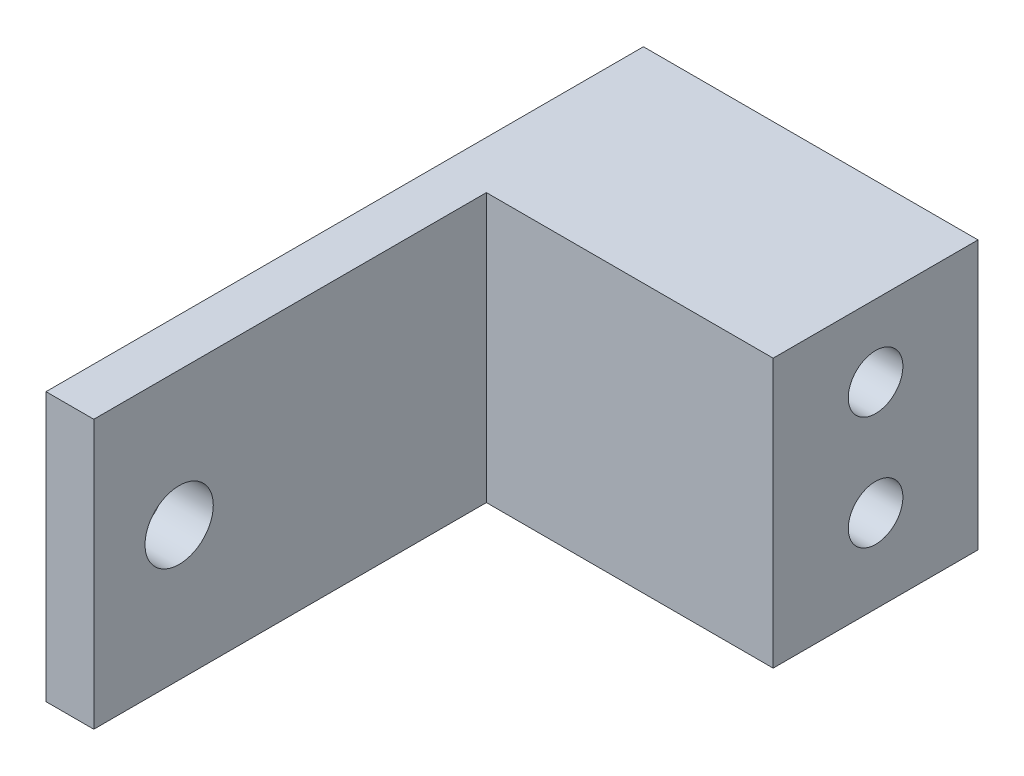
ISO-10303-21;
HEADER;
FILE_DESCRIPTION(('STEP AP214'),'2;1');
FILE_NAME('part.step','',(''),(''),'','','');
FILE_SCHEMA(('AUTOMOTIVE_DESIGN { 1 0 10303 214 1 1 1 1 }'));
ENDSEC;
DATA;
#1=APPLICATION_CONTEXT('core data for automotive mechanical design processes');
#2=APPLICATION_PROTOCOL_DEFINITION('international standard','automotive_design',2000,#1);
#3=PRODUCT_CONTEXT('',#1,'mechanical');
#4=PRODUCT('Part','Part','',(#3));
#5=PRODUCT_RELATED_PRODUCT_CATEGORY('part','',(#4));
#6=PRODUCT_DEFINITION_FORMATION('','',#4);
#7=PRODUCT_DEFINITION_CONTEXT('part definition',#1,'design');
#8=PRODUCT_DEFINITION('design','',#6,#7);
#9=PRODUCT_DEFINITION_SHAPE('','',#8);
#10=(LENGTH_UNIT() NAMED_UNIT(*) SI_UNIT(.MILLI.,.METRE.));
#11=(NAMED_UNIT(*) PLANE_ANGLE_UNIT() SI_UNIT($,.RADIAN.));
#12=(NAMED_UNIT(*) SI_UNIT($,.STERADIAN.) SOLID_ANGLE_UNIT());
#13=UNCERTAINTY_MEASURE_WITH_UNIT(LENGTH_MEASURE(1.E-05),#10,'distance_accuracy_value','');
#14=(GEOMETRIC_REPRESENTATION_CONTEXT(3) GLOBAL_UNCERTAINTY_ASSIGNED_CONTEXT((#13)) GLOBAL_UNIT_ASSIGNED_CONTEXT((#10,
#11,#12)) REPRESENTATION_CONTEXT('',''));
#15=CARTESIAN_POINT('',(0.,0.,0.));
#16=DIRECTION('',(0.,0.,1.));
#17=DIRECTION('',(1.,0.,0.));
#18=AXIS2_PLACEMENT_3D('',#15,#16,#17);
#19=CARTESIAN_POINT('',(16.8979552359479,-107.117375070724,-45.3447882917554));
#20=DIRECTION('',(0.,0.,-1.));
#21=DIRECTION('',(-1.,0.,0.));
#22=AXIS2_PLACEMENT_3D('',#19,#20,#21);
#23=PLANE('',#22);
#24=DIRECTION('',(0.,1.,0.));
#25=VECTOR('',#24,1.);
#26=CARTESIAN_POINT('',(18.2979552359479,-107.117375070724,-45.3447882917554));
#27=LINE('',#26,#25);
#28=CARTESIAN_POINT('',(18.2979552359479,-107.117375070724,-45.3447882917554));
#29=VERTEX_POINT('',#28);
#30=CARTESIAN_POINT('',(18.2979552359479,-99.2531130794142,-45.3447882917554));
#31=VERTEX_POINT('',#30);
#32=EDGE_CURVE('E48',#29,#31,#27,.T.);
#33=ORIENTED_EDGE('',*,*,#32,.F.);
#34=DIRECTION('',(1.,0.,0.));
#35=VECTOR('',#34,1.);
#36=CARTESIAN_POINT('',(16.8979552359479,-107.117375070724,-45.3447882917554));
#37=LINE('',#36,#35);
#38=CARTESIAN_POINT('',(26.6979552359479,-107.117375070724,-45.3447882917554));
#39=VERTEX_POINT('',#38);
#40=EDGE_CURVE('E41',#29,#39,#37,.T.);
#41=ORIENTED_EDGE('',*,*,#40,.T.);
#42=DIRECTION('',(0.,1.,0.));
#43=VECTOR('',#42,1.);
#44=CARTESIAN_POINT('',(26.6979552359479,-107.117375070724,-45.3447882917554));
#45=LINE('',#44,#43);
#46=CARTESIAN_POINT('',(26.6979552359479,-99.2531130794142,-45.3447882917554));
#47=VERTEX_POINT('',#46);
#48=EDGE_CURVE('E87',#39,#47,#45,.T.);
#49=ORIENTED_EDGE('',*,*,#48,.T.);
#50=DIRECTION('',(1.,0.,0.));
#51=VECTOR('',#50,1.);
#52=CARTESIAN_POINT('',(16.8979552359479,-99.2531130794142,-45.3447882917554));
#53=LINE('',#52,#51);
#54=EDGE_CURVE('E81',#31,#47,#53,.T.);
#55=ORIENTED_EDGE('',*,*,#54,.F.);
#56=EDGE_LOOP('',(#33,#41,#49,#55));
#57=FACE_BOUND('',#56,.T.);
#58=ADVANCED_FACE('F33',(#57),#23,.F.);
#59=CARTESIAN_POINT('',(16.8979552359479,-107.117375070724,-51.3447882917554));
#60=DIRECTION('',(0.,0.,1.));
#61=DIRECTION('',(1.,0.,0.));
#62=AXIS2_PLACEMENT_3D('',#59,#60,#61);
#63=PLANE('',#62);
#64=DIRECTION('',(0.,-1.,0.));
#65=VECTOR('',#64,1.);
#66=CARTESIAN_POINT('',(26.6979552359479,-107.117375070724,-51.3447882917554));
#67=LINE('',#66,#65);
#68=CARTESIAN_POINT('',(26.6979552359479,-99.2531130794142,-51.3447882917554));
#69=VERTEX_POINT('',#68);
#70=CARTESIAN_POINT('',(26.6979552359479,-107.117375070724,-51.3447882917554));
#71=VERTEX_POINT('',#70);
#72=EDGE_CURVE('E92',#69,#71,#67,.T.);
#73=ORIENTED_EDGE('',*,*,#72,.T.);
#74=DIRECTION('',(1.,0.,0.));
#75=VECTOR('',#74,1.);
#76=CARTESIAN_POINT('',(16.8979552359479,-107.117375070724,-51.3447882917554));
#77=LINE('',#76,#75);
#78=CARTESIAN_POINT('',(16.8979552359479,-107.117375070724,-51.3447882917554));
#79=VERTEX_POINT('',#78);
#80=EDGE_CURVE('E11',#79,#71,#77,.T.);
#81=ORIENTED_EDGE('',*,*,#80,.F.);
#82=DIRECTION('',(0.,-1.,0.));
#83=VECTOR('',#82,1.);
#84=CARTESIAN_POINT('',(16.8979552359479,-107.117375070724,-51.3447882917554));
#85=LINE('',#84,#83);
#86=CARTESIAN_POINT('',(16.8979552359479,-99.2531130794142,-51.3447882917554));
#87=VERTEX_POINT('',#86);
#88=EDGE_CURVE('E86',#87,#79,#85,.T.);
#89=ORIENTED_EDGE('',*,*,#88,.F.);
#90=DIRECTION('',(1.,0.,0.));
#91=VECTOR('',#90,1.);
#92=CARTESIAN_POINT('',(16.8979552359479,-99.2531130794142,-51.3447882917554));
#93=LINE('',#92,#91);
#94=EDGE_CURVE('E78',#87,#69,#93,.T.);
#95=ORIENTED_EDGE('',*,*,#94,.T.);
#96=EDGE_LOOP('',(#73,#81,#89,#95));
#97=FACE_BOUND('',#96,.T.);
#98=ADVANCED_FACE('F35',(#97),#63,.F.);
#99=CARTESIAN_POINT('',(16.8979552359479,-107.117375070724,-51.3447882917554));
#100=DIRECTION('',(0.,1.,0.));
#101=DIRECTION('',(0.,0.,1.));
#102=AXIS2_PLACEMENT_3D('',#99,#100,#101);
#103=PLANE('',#102);
#104=DIRECTION('',(0.,0.,1.));
#105=VECTOR('',#104,1.);
#106=CARTESIAN_POINT('',(26.6979552359479,-107.117375070724,-51.3447882917554));
#107=LINE('',#106,#105);
#108=EDGE_CURVE('E96',#71,#39,#107,.T.);
#109=ORIENTED_EDGE('',*,*,#108,.T.);
#110=ORIENTED_EDGE('',*,*,#40,.F.);
#111=DIRECTION('',(0.,0.,-1.));
#112=VECTOR('',#111,1.);
#113=CARTESIAN_POINT('',(18.2979552359479,-107.117375070724,-33.8447882917554));
#114=LINE('',#113,#112);
#115=CARTESIAN_POINT('',(18.2979552359479,-107.117375070724,-33.8447882917554));
#116=VERTEX_POINT('',#115);
#117=EDGE_CURVE('E97',#116,#29,#114,.T.);
#118=ORIENTED_EDGE('',*,*,#117,.F.);
#119=DIRECTION('',(1.,0.,0.));
#120=VECTOR('',#119,1.);
#121=CARTESIAN_POINT('',(16.8979552359479,-107.117375070724,-33.8447882917554));
#122=LINE('',#121,#120);
#123=CARTESIAN_POINT('',(16.8979552359479,-107.117375070724,-33.8447882917554));
#124=VERTEX_POINT('',#123);
#125=EDGE_CURVE('E115',#124,#116,#122,.T.);
#126=ORIENTED_EDGE('',*,*,#125,.F.);
#127=DIRECTION('',(0.,0.,1.));
#128=VECTOR('',#127,1.);
#129=CARTESIAN_POINT('',(16.8979552359479,-107.117375070724,-51.3447882917554));
#130=LINE('',#129,#128);
#131=EDGE_CURVE('E112',#79,#124,#130,.T.);
#132=ORIENTED_EDGE('',*,*,#131,.F.);
#133=ORIENTED_EDGE('',*,*,#80,.T.);
#134=EDGE_LOOP('',(#109,#110,#118,#126,#132,#133));
#135=FACE_BOUND('',#134,.T.);
#136=ADVANCED_FACE('F109',(#135),#103,.F.);
#137=CARTESIAN_POINT('',(16.8979552359479,-99.2531130794142,-51.3447882917554));
#138=DIRECTION('',(0.,-1.,0.));
#139=DIRECTION('',(0.,0.,-1.));
#140=AXIS2_PLACEMENT_3D('',#137,#138,#139);
#141=PLANE('',#140);
#142=DIRECTION('',(0.,0.,-1.));
#143=VECTOR('',#142,1.);
#144=CARTESIAN_POINT('',(26.6979552359479,-99.2531130794142,-51.3447882917554));
#145=LINE('',#144,#143);
#146=EDGE_CURVE('E75',#47,#69,#145,.T.);
#147=ORIENTED_EDGE('',*,*,#146,.T.);
#148=ORIENTED_EDGE('',*,*,#94,.F.);
#149=DIRECTION('',(0.,0.,-1.));
#150=VECTOR('',#149,1.);
#151=CARTESIAN_POINT('',(16.8979552359479,-99.2531130794142,-51.3447882917554));
#152=LINE('',#151,#150);
#153=CARTESIAN_POINT('',(16.8979552359479,-99.2531130794142,-33.8447882917554));
#154=VERTEX_POINT('',#153);
#155=EDGE_CURVE('E57',#154,#87,#152,.T.);
#156=ORIENTED_EDGE('',*,*,#155,.F.);
#157=DIRECTION('',(-1.,0.,0.));
#158=VECTOR('',#157,1.);
#159=CARTESIAN_POINT('',(16.8979552359479,-99.2531130794142,-33.8447882917554));
#160=LINE('',#159,#158);
#161=CARTESIAN_POINT('',(18.2979552359479,-99.2531130794142,-33.8447882917554));
#162=VERTEX_POINT('',#161);
#163=EDGE_CURVE('E121',#162,#154,#160,.T.);
#164=ORIENTED_EDGE('',*,*,#163,.F.);
#165=DIRECTION('',(0.,0.,-1.));
#166=VECTOR('',#165,1.);
#167=CARTESIAN_POINT('',(18.2979552359479,-99.2531130794142,-33.8447882917554));
#168=LINE('',#167,#166);
#169=EDGE_CURVE('E101',#162,#31,#168,.T.);
#170=ORIENTED_EDGE('',*,*,#169,.T.);
#171=ORIENTED_EDGE('',*,*,#54,.T.);
#172=EDGE_LOOP('',(#147,#148,#156,#164,#170,#171));
#173=FACE_BOUND('',#172,.T.);
#174=ADVANCED_FACE('F77',(#173),#141,.F.);
#175=CARTESIAN_POINT('',(16.8979552359479,0.,0.));
#176=DIRECTION('',(1.,0.,0.));
#177=DIRECTION('',(0.,0.,-1.));
#178=AXIS2_PLACEMENT_3D('',#175,#176,#177);
#179=PLANE('',#178);
#180=CARTESIAN_POINT('',(16.8979552359479,-104.677829932417,-48.3447882917554));
#181=DIRECTION('',(1.,0.,0.));
#182=DIRECTION('',(0.,0.,-1.));
#183=AXIS2_PLACEMENT_3D('',#180,#181,#182);
#184=CIRCLE('',#183,0.799999999999995);
#185=CARTESIAN_POINT('',(16.8979552359479,-104.677829932417,-49.1447882917554));
#186=VERTEX_POINT('',#185);
#187=EDGE_CURVE('E143',#186,#186,#184,.T.);
#188=ORIENTED_EDGE('',*,*,#187,.T.);
#189=EDGE_LOOP('',(#188));
#190=FACE_BOUND('',#189,.T.);
#191=CARTESIAN_POINT('',(16.8979552359479,-101.359309210704,-48.3447882917554));
#192=DIRECTION('',(1.,0.,0.));
#193=DIRECTION('',(0.,0.,-1.));
#194=AXIS2_PLACEMENT_3D('',#191,#192,#193);
#195=CIRCLE('',#194,0.799999999999995);
#196=CARTESIAN_POINT('',(16.8979552359479,-101.359309210704,-49.1447882917554));
#197=VERTEX_POINT('',#196);
#198=EDGE_CURVE('E137',#197,#197,#195,.T.);
#199=ORIENTED_EDGE('',*,*,#198,.T.);
#200=EDGE_LOOP('',(#199));
#201=FACE_BOUND('',#200,.T.);
#202=CARTESIAN_POINT('',(16.8979552359479,-103.185244075069,-36.3447882917554));
#203=DIRECTION('',(1.,0.,0.));
#204=DIRECTION('',(0.,0.,-1.));
#205=AXIS2_PLACEMENT_3D('',#202,#203,#204);
#206=CIRCLE('',#205,0.999999999999998);
#207=CARTESIAN_POINT('',(16.8979552359479,-103.185244075069,-37.3447882917554));
#208=VERTEX_POINT('',#207);
#209=EDGE_CURVE('E124',#208,#208,#206,.F.);
#210=ORIENTED_EDGE('',*,*,#209,.F.);
#211=EDGE_LOOP('',(#210));
#212=FACE_BOUND('',#211,.T.);
#213=ORIENTED_EDGE('',*,*,#88,.T.);
#214=ORIENTED_EDGE('',*,*,#131,.T.);
#215=DIRECTION('',(0.,-1.,0.));
#216=VECTOR('',#215,1.);
#217=CARTESIAN_POINT('',(16.8979552359479,-107.117375070724,-33.8447882917554));
#218=LINE('',#217,#216);
#219=EDGE_CURVE('E123',#154,#124,#218,.T.);
#220=ORIENTED_EDGE('',*,*,#219,.F.);
#221=ORIENTED_EDGE('',*,*,#155,.T.);
#222=EDGE_LOOP('',(#213,#214,#220,#221));
#223=FACE_BOUND('',#222,.T.);
#224=ADVANCED_FACE('F117',(#190,#201,#212,#223),#179,.F.);
#225=CARTESIAN_POINT('',(26.6979552359479,0.,0.));
#226=DIRECTION('',(1.,0.,0.));
#227=DIRECTION('',(0.,0.,-1.));
#228=AXIS2_PLACEMENT_3D('',#225,#226,#227);
#229=PLANE('',#228);
#230=CARTESIAN_POINT('',(26.6979552359479,-104.677829932417,-48.3447882917554));
#231=DIRECTION('',(1.,0.,0.));
#232=DIRECTION('',(0.,0.,-1.));
#233=AXIS2_PLACEMENT_3D('',#230,#231,#232);
#234=CIRCLE('',#233,0.799999999999995);
#235=CARTESIAN_POINT('',(26.6979552359479,-104.677829932417,-49.1447882917554));
#236=VERTEX_POINT('',#235);
#237=EDGE_CURVE('E146',#236,#236,#234,.T.);
#238=ORIENTED_EDGE('',*,*,#237,.F.);
#239=EDGE_LOOP('',(#238));
#240=FACE_BOUND('',#239,.T.);
#241=CARTESIAN_POINT('',(26.6979552359479,-101.359309210704,-48.3447882917554));
#242=DIRECTION('',(1.,0.,0.));
#243=DIRECTION('',(0.,0.,-1.));
#244=AXIS2_PLACEMENT_3D('',#241,#242,#243);
#245=CIRCLE('',#244,0.799999999999995);
#246=CARTESIAN_POINT('',(26.6979552359479,-101.359309210704,-49.1447882917554));
#247=VERTEX_POINT('',#246);
#248=EDGE_CURVE('E140',#247,#247,#245,.T.);
#249=ORIENTED_EDGE('',*,*,#248,.F.);
#250=EDGE_LOOP('',(#249));
#251=FACE_BOUND('',#250,.T.);
#252=ORIENTED_EDGE('',*,*,#72,.F.);
#253=ORIENTED_EDGE('',*,*,#146,.F.);
#254=ORIENTED_EDGE('',*,*,#48,.F.);
#255=ORIENTED_EDGE('',*,*,#108,.F.);
#256=EDGE_LOOP('',(#252,#253,#254,#255));
#257=FACE_BOUND('',#256,.T.);
#258=ADVANCED_FACE('F94',(#240,#251,#257),#229,.T.);
#259=CARTESIAN_POINT('',(18.2979552359479,-107.117375070724,-33.8447882917554));
#260=DIRECTION('',(-1.,0.,0.));
#261=DIRECTION('',(0.,0.,1.));
#262=AXIS2_PLACEMENT_3D('',#259,#260,#261);
#263=PLANE('',#262);
#264=CARTESIAN_POINT('',(18.2979552359479,-103.185244075069,-36.3447882917554));
#265=DIRECTION('',(1.,0.,0.));
#266=DIRECTION('',(0.,0.,-1.));
#267=AXIS2_PLACEMENT_3D('',#264,#265,#266);
#268=CIRCLE('',#267,0.999999999999998);
#269=CARTESIAN_POINT('',(18.2979552359479,-103.185244075069,-37.3447882917554));
#270=VERTEX_POINT('',#269);
#271=EDGE_CURVE('E134',#270,#270,#268,.T.);
#272=ORIENTED_EDGE('',*,*,#271,.F.);
#273=EDGE_LOOP('',(#272));
#274=FACE_BOUND('',#273,.T.);
#275=ORIENTED_EDGE('',*,*,#32,.T.);
#276=ORIENTED_EDGE('',*,*,#169,.F.);
#277=DIRECTION('',(0.,1.,0.));
#278=VECTOR('',#277,1.);
#279=CARTESIAN_POINT('',(18.2979552359479,-107.117375070724,-33.8447882917554));
#280=LINE('',#279,#278);
#281=EDGE_CURVE('E127',#116,#162,#280,.T.);
#282=ORIENTED_EDGE('',*,*,#281,.F.);
#283=ORIENTED_EDGE('',*,*,#117,.T.);
#284=EDGE_LOOP('',(#275,#276,#282,#283));
#285=FACE_BOUND('',#284,.T.);
#286=ADVANCED_FACE('F155',(#274,#285),#263,.F.);
#287=CARTESIAN_POINT('',(0.,0.,-33.8447882917554));
#288=DIRECTION('',(0.,0.,-1.));
#289=DIRECTION('',(-1.,0.,0.));
#290=AXIS2_PLACEMENT_3D('',#287,#288,#289);
#291=PLANE('',#290);
#292=ORIENTED_EDGE('',*,*,#219,.T.);
#293=ORIENTED_EDGE('',*,*,#125,.T.);
#294=ORIENTED_EDGE('',*,*,#281,.T.);
#295=ORIENTED_EDGE('',*,*,#163,.T.);
#296=EDGE_LOOP('',(#292,#293,#294,#295));
#297=FACE_BOUND('',#296,.T.);
#298=ADVANCED_FACE('F174',(#297),#291,.F.);
#299=CARTESIAN_POINT('',(14.0695281112017,-103.185244075069,-36.3447882917554));
#300=DIRECTION('',(1.,0.,0.));
#301=DIRECTION('',(0.,0.,-1.));
#302=AXIS2_PLACEMENT_3D('',#299,#300,#301);
#303=CYLINDRICAL_SURFACE('',#302,0.999999999999998);
#304=ORIENTED_EDGE('',*,*,#209,.T.);
#305=EDGE_LOOP('',(#304));
#306=FACE_BOUND('',#305,.T.);
#307=ORIENTED_EDGE('',*,*,#271,.T.);
#308=EDGE_LOOP('',(#307));
#309=FACE_BOUND('',#308,.T.);
#310=ADVANCED_FACE('F162',(#306,#309),#303,.F.);
#311=CARTESIAN_POINT('',(26.6979552359479,-101.359309210704,-48.3447882917554));
#312=DIRECTION('',(1.,0.,0.));
#313=DIRECTION('',(0.,0.,-1.));
#314=AXIS2_PLACEMENT_3D('',#311,#312,#313);
#315=CYLINDRICAL_SURFACE('',#314,0.799999999999995);
#316=ORIENTED_EDGE('',*,*,#248,.T.);
#317=EDGE_LOOP('',(#316));
#318=FACE_BOUND('',#317,.T.);
#319=ORIENTED_EDGE('',*,*,#198,.F.);
#320=EDGE_LOOP('',(#319));
#321=FACE_BOUND('',#320,.T.);
#322=ADVANCED_FACE('F159',(#318,#321),#315,.F.);
#323=CARTESIAN_POINT('',(26.6979552359479,-104.677829932417,-48.3447882917554));
#324=DIRECTION('',(1.,0.,0.));
#325=DIRECTION('',(0.,0.,-1.));
#326=AXIS2_PLACEMENT_3D('',#323,#324,#325);
#327=CYLINDRICAL_SURFACE('',#326,0.799999999999995);
#328=ORIENTED_EDGE('',*,*,#237,.T.);
#329=EDGE_LOOP('',(#328));
#330=FACE_BOUND('',#329,.T.);
#331=ORIENTED_EDGE('',*,*,#187,.F.);
#332=EDGE_LOOP('',(#331));
#333=FACE_BOUND('',#332,.T.);
#334=ADVANCED_FACE('F150',(#330,#333),#327,.F.);
#335=CLOSED_SHELL('',(#58,#98,#136,#174,#224,#258,#286,#298,#310,#322,#334));
#336=MANIFOLD_SOLID_BREP('B2',#335);
#337=ADVANCED_BREP_SHAPE_REPRESENTATION('',(#18,#336),#14);
#338=SHAPE_DEFINITION_REPRESENTATION(#9,#337);
ENDSEC;
END-ISO-10303-21;
